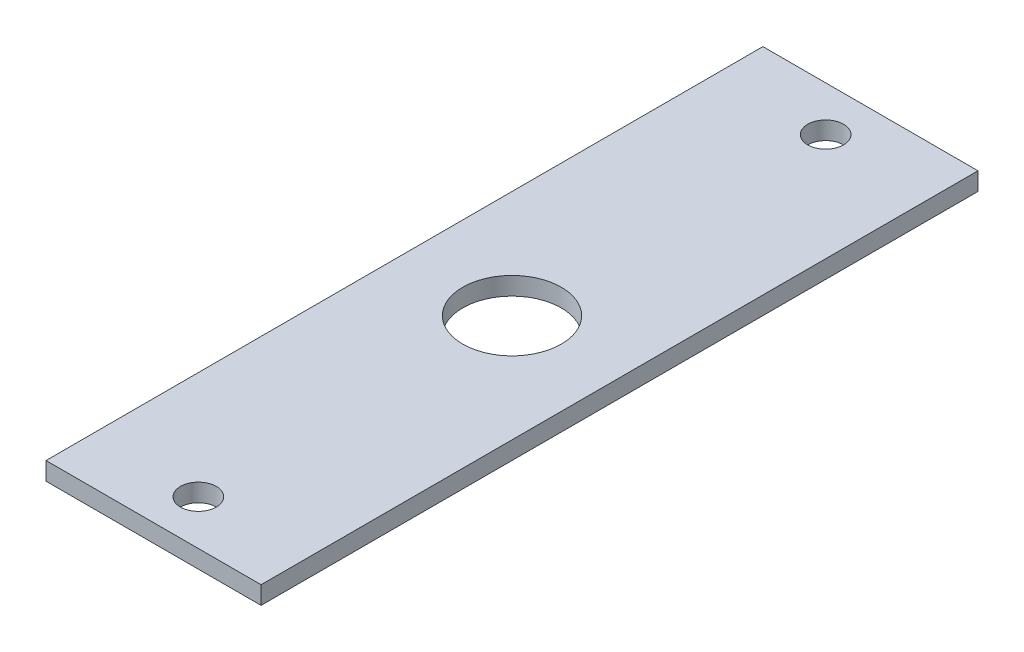
ISO-10303-21;
HEADER;
FILE_DESCRIPTION(('STEP AP214'),'2;1');
FILE_NAME('part.step','',(''),(''),'','','');
FILE_SCHEMA(('AUTOMOTIVE_DESIGN { 1 0 10303 214 1 1 1 1 }'));
ENDSEC;
DATA;
#1=APPLICATION_CONTEXT('core data for automotive mechanical design processes');
#2=APPLICATION_PROTOCOL_DEFINITION('international standard','automotive_design',2000,#1);
#3=PRODUCT_CONTEXT('',#1,'mechanical');
#4=PRODUCT('Part','Part','',(#3));
#5=PRODUCT_RELATED_PRODUCT_CATEGORY('part','',(#4));
#6=PRODUCT_DEFINITION_FORMATION('','',#4);
#7=PRODUCT_DEFINITION_CONTEXT('part definition',#1,'design');
#8=PRODUCT_DEFINITION('design','',#6,#7);
#9=PRODUCT_DEFINITION_SHAPE('','',#8);
#10=(LENGTH_UNIT() NAMED_UNIT(*) SI_UNIT(.MILLI.,.METRE.));
#11=(NAMED_UNIT(*) PLANE_ANGLE_UNIT() SI_UNIT($,.RADIAN.));
#12=(NAMED_UNIT(*) SI_UNIT($,.STERADIAN.) SOLID_ANGLE_UNIT());
#13=UNCERTAINTY_MEASURE_WITH_UNIT(LENGTH_MEASURE(1.E-05),#10,'distance_accuracy_value','');
#14=(GEOMETRIC_REPRESENTATION_CONTEXT(3) GLOBAL_UNCERTAINTY_ASSIGNED_CONTEXT((#13)) GLOBAL_UNIT_ASSIGNED_CONTEXT((#10,
#11,#12)) REPRESENTATION_CONTEXT('',''));
#15=CARTESIAN_POINT('',(0.,0.,0.));
#16=DIRECTION('',(0.,0.,1.));
#17=DIRECTION('',(1.,0.,0.));
#18=AXIS2_PLACEMENT_3D('',#15,#16,#17);
#19=CARTESIAN_POINT('',(0.,-1.5875,0.));
#20=DIRECTION('',(0.,-1.,0.));
#21=DIRECTION('',(0.,0.,-1.));
#22=AXIS2_PLACEMENT_3D('',#19,#20,#21);
#23=PLANE('',#22);
#24=DIRECTION('',(0.,0.,-1.));
#25=VECTOR('',#24,1.);
#26=CARTESIAN_POINT('',(-19.05,-1.5875,63.5));
#27=LINE('',#26,#25);
#28=CARTESIAN_POINT('',(-19.05,-1.5875,63.5));
#29=VERTEX_POINT('',#28);
#30=CARTESIAN_POINT('',(-19.05,-1.5875,-63.5));
#31=VERTEX_POINT('',#30);
#32=EDGE_CURVE('E64',#29,#31,#27,.T.);
#33=ORIENTED_EDGE('',*,*,#32,.T.);
#34=DIRECTION('',(1.,0.,0.));
#35=VECTOR('',#34,1.);
#36=CARTESIAN_POINT('',(-19.05,-1.5875,-63.5));
#37=LINE('',#36,#35);
#38=CARTESIAN_POINT('',(19.05,-1.5875,-63.5));
#39=VERTEX_POINT('',#38);
#40=EDGE_CURVE('E227',#31,#39,#37,.T.);
#41=ORIENTED_EDGE('',*,*,#40,.T.);
#42=DIRECTION('',(0.,0.,1.));
#43=VECTOR('',#42,1.);
#44=CARTESIAN_POINT('',(19.05,-1.5875,63.5));
#45=LINE('',#44,#43);
#46=CARTESIAN_POINT('',(19.05,-1.5875,63.5));
#47=VERTEX_POINT('',#46);
#48=EDGE_CURVE('E70',#39,#47,#45,.T.);
#49=ORIENTED_EDGE('',*,*,#48,.T.);
#50=DIRECTION('',(-1.,0.,0.));
#51=VECTOR('',#50,1.);
#52=CARTESIAN_POINT('',(-19.05,-1.5875,63.5));
#53=LINE('',#52,#51);
#54=EDGE_CURVE('E68',#47,#29,#53,.T.);
#55=ORIENTED_EDGE('',*,*,#54,.T.);
#56=EDGE_LOOP('',(#33,#41,#49,#55));
#57=FACE_BOUND('',#56,.T.);
#58=CARTESIAN_POINT('',(0.,-1.5875,0.));
#59=DIRECTION('',(0.,1.,0.));
#60=DIRECTION('',(0.,0.,1.));
#61=AXIS2_PLACEMENT_3D('',#58,#59,#60);
#62=CIRCLE('',#61,8.73125);
#63=CARTESIAN_POINT('',(0.,-1.5875,8.73125));
#64=VERTEX_POINT('',#63);
#65=EDGE_CURVE('E77',#64,#64,#62,.T.);
#66=ORIENTED_EDGE('',*,*,#65,.T.);
#67=EDGE_LOOP('',(#66));
#68=FACE_BOUND('',#67,.T.);
#69=CARTESIAN_POINT('',(0.,-1.5875,55.5625));
#70=DIRECTION('',(0.,1.,0.));
#71=DIRECTION('',(0.,0.,1.));
#72=AXIS2_PLACEMENT_3D('',#69,#70,#71);
#73=CIRCLE('',#72,3.175);
#74=CARTESIAN_POINT('',(0.,-1.5875,58.7375));
#75=VERTEX_POINT('',#74);
#76=EDGE_CURVE('E109',#75,#75,#73,.T.);
#77=ORIENTED_EDGE('',*,*,#76,.T.);
#78=EDGE_LOOP('',(#77));
#79=FACE_BOUND('',#78,.T.);
#80=CARTESIAN_POINT('',(0.,-1.5875,-55.5625));
#81=DIRECTION('',(0.,1.,0.));
#82=DIRECTION('',(0.,0.,1.));
#83=AXIS2_PLACEMENT_3D('',#80,#81,#82);
#84=CIRCLE('',#83,3.175);
#85=CARTESIAN_POINT('',(0.,-1.5875,-52.3875));
#86=VERTEX_POINT('',#85);
#87=EDGE_CURVE('E20',#86,#86,#84,.T.);
#88=ORIENTED_EDGE('',*,*,#87,.T.);
#89=EDGE_LOOP('',(#88));
#90=FACE_BOUND('',#89,.T.);
#91=ADVANCED_FACE('F17',(#57,#68,#79,#90),#23,.T.);
#92=CARTESIAN_POINT('',(0.,-1.5875,-55.5625));
#93=DIRECTION('',(0.,1.,0.));
#94=DIRECTION('',(0.,0.,1.));
#95=AXIS2_PLACEMENT_3D('',#92,#93,#94);
#96=CYLINDRICAL_SURFACE('',#95,3.175);
#97=ORIENTED_EDGE('',*,*,#87,.F.);
#98=EDGE_LOOP('',(#97));
#99=FACE_BOUND('',#98,.T.);
#100=CARTESIAN_POINT('',(0.,1.5875,-55.5625));
#101=DIRECTION('',(0.,1.,0.));
#102=DIRECTION('',(0.,0.,1.));
#103=AXIS2_PLACEMENT_3D('',#100,#101,#102);
#104=CIRCLE('',#103,3.175);
#105=CARTESIAN_POINT('',(0.,1.5875,-52.3875));
#106=VERTEX_POINT('',#105);
#107=EDGE_CURVE('E103',#106,#106,#104,.T.);
#108=ORIENTED_EDGE('',*,*,#107,.T.);
#109=EDGE_LOOP('',(#108));
#110=FACE_BOUND('',#109,.T.);
#111=ADVANCED_FACE('F121',(#99,#110),#96,.F.);
#112=CARTESIAN_POINT('',(0.,-1.5875,55.5625));
#113=DIRECTION('',(0.,1.,0.));
#114=DIRECTION('',(0.,0.,1.));
#115=AXIS2_PLACEMENT_3D('',#112,#113,#114);
#116=CYLINDRICAL_SURFACE('',#115,3.175);
#117=ORIENTED_EDGE('',*,*,#76,.F.);
#118=EDGE_LOOP('',(#117));
#119=FACE_BOUND('',#118,.T.);
#120=CARTESIAN_POINT('',(0.,1.5875,55.5625));
#121=DIRECTION('',(0.,1.,0.));
#122=DIRECTION('',(0.,0.,1.));
#123=AXIS2_PLACEMENT_3D('',#120,#121,#122);
#124=CIRCLE('',#123,3.175);
#125=CARTESIAN_POINT('',(0.,1.5875,58.7375));
#126=VERTEX_POINT('',#125);
#127=EDGE_CURVE('E99',#126,#126,#124,.T.);
#128=ORIENTED_EDGE('',*,*,#127,.T.);
#129=EDGE_LOOP('',(#128));
#130=FACE_BOUND('',#129,.T.);
#131=ADVANCED_FACE('F124',(#119,#130),#116,.F.);
#132=CARTESIAN_POINT('',(0.,-17.4625,0.));
#133=DIRECTION('',(0.,1.,0.));
#134=DIRECTION('',(0.,0.,1.));
#135=AXIS2_PLACEMENT_3D('',#132,#133,#134);
#136=CYLINDRICAL_SURFACE('',#135,8.73125);
#137=ORIENTED_EDGE('',*,*,#65,.F.);
#138=EDGE_LOOP('',(#137));
#139=FACE_BOUND('',#138,.T.);
#140=CARTESIAN_POINT('',(0.,1.5875,0.));
#141=DIRECTION('',(0.,1.,0.));
#142=DIRECTION('',(0.,0.,1.));
#143=AXIS2_PLACEMENT_3D('',#140,#141,#142);
#144=CIRCLE('',#143,8.73125);
#145=CARTESIAN_POINT('',(0.,1.5875,8.73125));
#146=VERTEX_POINT('',#145);
#147=EDGE_CURVE('E95',#146,#146,#144,.T.);
#148=ORIENTED_EDGE('',*,*,#147,.T.);
#149=EDGE_LOOP('',(#148));
#150=FACE_BOUND('',#149,.T.);
#151=ADVANCED_FACE('F148',(#139,#150),#136,.F.);
#152=CARTESIAN_POINT('',(-19.05,1.5875,63.5));
#153=DIRECTION('',(0.,0.,-1.));
#154=DIRECTION('',(-1.,0.,0.));
#155=AXIS2_PLACEMENT_3D('',#152,#153,#154);
#156=PLANE('',#155);
#157=DIRECTION('',(0.,1.,0.));
#158=VECTOR('',#157,1.);
#159=CARTESIAN_POINT('',(19.05,1.5875,63.5));
#160=LINE('',#159,#158);
#161=CARTESIAN_POINT('',(19.05,1.5875,63.5));
#162=VERTEX_POINT('',#161);
#163=EDGE_CURVE('E239',#47,#162,#160,.T.);
#164=ORIENTED_EDGE('',*,*,#163,.T.);
#165=DIRECTION('',(1.,0.,0.));
#166=VECTOR('',#165,1.);
#167=CARTESIAN_POINT('',(0.,1.5875,63.5));
#168=LINE('',#167,#166);
#169=CARTESIAN_POINT('',(-19.05,1.5875,63.5));
#170=VERTEX_POINT('',#169);
#171=EDGE_CURVE('E89',#162,#170,#168,.F.);
#172=ORIENTED_EDGE('',*,*,#171,.T.);
#173=DIRECTION('',(0.,1.,0.));
#174=VECTOR('',#173,1.);
#175=CARTESIAN_POINT('',(-19.05,1.5875,63.5));
#176=LINE('',#175,#174);
#177=EDGE_CURVE('E76',#170,#29,#176,.F.);
#178=ORIENTED_EDGE('',*,*,#177,.T.);
#179=ORIENTED_EDGE('',*,*,#54,.F.);
#180=EDGE_LOOP('',(#164,#172,#178,#179));
#181=FACE_BOUND('',#180,.T.);
#182=ADVANCED_FACE('F88',(#181),#156,.F.);
#183=CARTESIAN_POINT('',(-19.05,1.5875,63.5));
#184=DIRECTION('',(1.,0.,0.));
#185=DIRECTION('',(0.,0.,-1.));
#186=AXIS2_PLACEMENT_3D('',#183,#184,#185);
#187=PLANE('',#186);
#188=ORIENTED_EDGE('',*,*,#177,.F.);
#189=DIRECTION('',(0.,0.,-1.));
#190=VECTOR('',#189,1.);
#191=CARTESIAN_POINT('',(-19.05,1.5875,0.));
#192=LINE('',#191,#190);
#193=CARTESIAN_POINT('',(-19.05,1.5875,-63.5));
#194=VERTEX_POINT('',#193);
#195=EDGE_CURVE('E229',#170,#194,#192,.T.);
#196=ORIENTED_EDGE('',*,*,#195,.T.);
#197=DIRECTION('',(0.,1.,0.));
#198=VECTOR('',#197,1.);
#199=CARTESIAN_POINT('',(-19.05,1.5875,-63.5));
#200=LINE('',#199,#198);
#201=EDGE_CURVE('E84',#194,#31,#200,.F.);
#202=ORIENTED_EDGE('',*,*,#201,.T.);
#203=ORIENTED_EDGE('',*,*,#32,.F.);
#204=EDGE_LOOP('',(#188,#196,#202,#203));
#205=FACE_BOUND('',#204,.T.);
#206=ADVANCED_FACE('F81',(#205),#187,.F.);
#207=CARTESIAN_POINT('',(-19.05,1.5875,-63.5));
#208=DIRECTION('',(0.,0.,1.));
#209=DIRECTION('',(1.,0.,0.));
#210=AXIS2_PLACEMENT_3D('',#207,#208,#209);
#211=PLANE('',#210);
#212=ORIENTED_EDGE('',*,*,#201,.F.);
#213=DIRECTION('',(1.,0.,0.));
#214=VECTOR('',#213,1.);
#215=CARTESIAN_POINT('',(0.,1.5875,-63.5));
#216=LINE('',#215,#214);
#217=CARTESIAN_POINT('',(19.05,1.5875,-63.5));
#218=VERTEX_POINT('',#217);
#219=EDGE_CURVE('E27',#194,#218,#216,.T.);
#220=ORIENTED_EDGE('',*,*,#219,.T.);
#221=DIRECTION('',(0.,1.,0.));
#222=VECTOR('',#221,1.);
#223=CARTESIAN_POINT('',(19.05,1.5875,-63.5));
#224=LINE('',#223,#222);
#225=EDGE_CURVE('E38',#218,#39,#224,.F.);
#226=ORIENTED_EDGE('',*,*,#225,.T.);
#227=ORIENTED_EDGE('',*,*,#40,.F.);
#228=EDGE_LOOP('',(#212,#220,#226,#227));
#229=FACE_BOUND('',#228,.T.);
#230=ADVANCED_FACE('F136',(#229),#211,.F.);
#231=CARTESIAN_POINT('',(19.05,1.5875,63.5));
#232=DIRECTION('',(-1.,0.,0.));
#233=DIRECTION('',(0.,0.,1.));
#234=AXIS2_PLACEMENT_3D('',#231,#232,#233);
#235=PLANE('',#234);
#236=ORIENTED_EDGE('',*,*,#225,.F.);
#237=DIRECTION('',(0.,0.,-1.));
#238=VECTOR('',#237,1.);
#239=CARTESIAN_POINT('',(19.05,1.5875,0.));
#240=LINE('',#239,#238);
#241=EDGE_CURVE('E11',#218,#162,#240,.F.);
#242=ORIENTED_EDGE('',*,*,#241,.T.);
#243=ORIENTED_EDGE('',*,*,#163,.F.);
#244=ORIENTED_EDGE('',*,*,#48,.F.);
#245=EDGE_LOOP('',(#236,#242,#243,#244));
#246=FACE_BOUND('',#245,.T.);
#247=ADVANCED_FACE('F129',(#246),#235,.F.);
#248=CARTESIAN_POINT('',(0.,1.5875,0.));
#249=DIRECTION('',(0.,-1.,0.));
#250=DIRECTION('',(0.,0.,-1.));
#251=AXIS2_PLACEMENT_3D('',#248,#249,#250);
#252=PLANE('',#251);
#253=ORIENTED_EDGE('',*,*,#219,.F.);
#254=ORIENTED_EDGE('',*,*,#195,.F.);
#255=ORIENTED_EDGE('',*,*,#171,.F.);
#256=ORIENTED_EDGE('',*,*,#241,.F.);
#257=EDGE_LOOP('',(#253,#254,#255,#256));
#258=FACE_BOUND('',#257,.T.);
#259=ORIENTED_EDGE('',*,*,#147,.F.);
#260=EDGE_LOOP('',(#259));
#261=FACE_BOUND('',#260,.T.);
#262=ORIENTED_EDGE('',*,*,#127,.F.);
#263=EDGE_LOOP('',(#262));
#264=FACE_BOUND('',#263,.T.);
#265=ORIENTED_EDGE('',*,*,#107,.F.);
#266=EDGE_LOOP('',(#265));
#267=FACE_BOUND('',#266,.T.);
#268=ADVANCED_FACE('F127',(#258,#261,#264,#267),#252,.F.);
#269=CLOSED_SHELL('',(#91,#111,#131,#151,#182,#206,#230,#247,#268));
#270=MANIFOLD_SOLID_BREP('B1',#269);
#271=ADVANCED_BREP_SHAPE_REPRESENTATION('',(#18,#270),#14);
#272=SHAPE_DEFINITION_REPRESENTATION(#9,#271);
ENDSEC;
END-ISO-10303-21;
